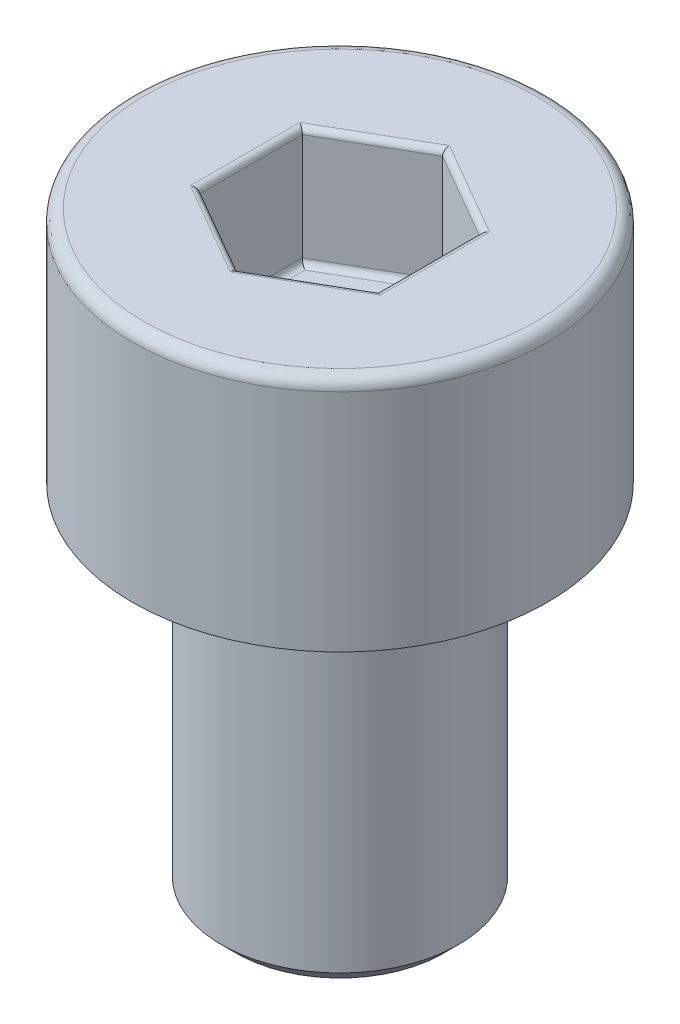
ISO-10303-21;
HEADER;
FILE_DESCRIPTION(('STEP AP214'),'2;1');
FILE_NAME('part.step','',(''),(''),'','','');
FILE_SCHEMA(('AUTOMOTIVE_DESIGN { 1 0 10303 214 1 1 1 1 }'));
ENDSEC;
DATA;
#1=APPLICATION_CONTEXT('core data for automotive mechanical design processes');
#2=APPLICATION_PROTOCOL_DEFINITION('international standard','automotive_design',2000,#1);
#3=PRODUCT_CONTEXT('',#1,'mechanical');
#4=PRODUCT('Part','Part','',(#3));
#5=PRODUCT_RELATED_PRODUCT_CATEGORY('part','',(#4));
#6=PRODUCT_DEFINITION_FORMATION('','',#4);
#7=PRODUCT_DEFINITION_CONTEXT('part definition',#1,'design');
#8=PRODUCT_DEFINITION('design','',#6,#7);
#9=PRODUCT_DEFINITION_SHAPE('','',#8);
#10=(LENGTH_UNIT() NAMED_UNIT(*) SI_UNIT(.MILLI.,.METRE.));
#11=(NAMED_UNIT(*) PLANE_ANGLE_UNIT() SI_UNIT($,.RADIAN.));
#12=(NAMED_UNIT(*) SI_UNIT($,.STERADIAN.) SOLID_ANGLE_UNIT());
#13=UNCERTAINTY_MEASURE_WITH_UNIT(LENGTH_MEASURE(1.E-05),#10,'distance_accuracy_value','');
#14=(GEOMETRIC_REPRESENTATION_CONTEXT(3) GLOBAL_UNCERTAINTY_ASSIGNED_CONTEXT((#13)) GLOBAL_UNIT_ASSIGNED_CONTEXT((#10,
#11,#12)) REPRESENTATION_CONTEXT('',''));
#15=CARTESIAN_POINT('',(0.,0.,0.));
#16=DIRECTION('',(0.,0.,1.));
#17=DIRECTION('',(1.,0.,0.));
#18=AXIS2_PLACEMENT_3D('',#15,#16,#17);
#19=CARTESIAN_POINT('',(0.,-10.,0.));
#20=DIRECTION('',(0.,-1.,0.));
#21=DIRECTION('',(0.,0.,-1.));
#22=AXIS2_PLACEMENT_3D('',#19,#20,#21);
#23=PLANE('',#22);
#24=CARTESIAN_POINT('',(0.,-10.,0.));
#25=DIRECTION('',(0.,-1.,0.));
#26=DIRECTION('',(0.,0.,-1.));
#27=AXIS2_PLACEMENT_3D('',#24,#25,#26);
#28=CIRCLE('',#27,1.74999999999999);
#29=CARTESIAN_POINT('',(0.,-10.,-1.74999999999999));
#30=VERTEX_POINT('',#29);
#31=EDGE_CURVE('E261',#30,#30,#28,.T.);
#32=ORIENTED_EDGE('',*,*,#31,.T.);
#33=EDGE_LOOP('',(#32));
#34=FACE_BOUND('',#33,.T.);
#35=ADVANCED_FACE('F33',(#34),#23,.T.);
#36=CARTESIAN_POINT('',(0.,0.,0.));
#37=DIRECTION('',(0.,1.,0.));
#38=DIRECTION('',(0.,0.,1.));
#39=AXIS2_PLACEMENT_3D('',#36,#37,#38);
#40=CYLINDRICAL_SURFACE('',#39,2.);
#41=CARTESIAN_POINT('',(0.,-4.25,0.));
#42=DIRECTION('',(0.,-1.,0.));
#43=DIRECTION('',(0.,0.,-1.));
#44=AXIS2_PLACEMENT_3D('',#41,#42,#43);
#45=CIRCLE('',#44,2.);
#46=CARTESIAN_POINT('',(0.,-4.25,-2.));
#47=VERTEX_POINT('',#46);
#48=EDGE_CURVE('E258',#47,#47,#45,.T.);
#49=ORIENTED_EDGE('',*,*,#48,.T.);
#50=EDGE_LOOP('',(#49));
#51=FACE_BOUND('',#50,.T.);
#52=CARTESIAN_POINT('',(0.,-9.75,0.));
#53=DIRECTION('',(0.,-1.,0.));
#54=DIRECTION('',(0.,0.,-1.));
#55=AXIS2_PLACEMENT_3D('',#52,#53,#54);
#56=CIRCLE('',#55,2.);
#57=CARTESIAN_POINT('',(0.,-9.75,-2.));
#58=VERTEX_POINT('',#57);
#59=EDGE_CURVE('E255',#58,#58,#56,.F.);
#60=ORIENTED_EDGE('',*,*,#59,.T.);
#61=EDGE_LOOP('',(#60));
#62=FACE_BOUND('',#61,.T.);
#63=ADVANCED_FACE('F287',(#51,#62),#40,.T.);
#64=CARTESIAN_POINT('',(-2.,-4.,0.));
#65=DIRECTION('',(0.,-1.,0.));
#66=DIRECTION('',(0.,0.,-1.));
#67=AXIS2_PLACEMENT_3D('',#64,#65,#66);
#68=PLANE('',#67);
#69=CARTESIAN_POINT('',(0.,-4.,0.));
#70=DIRECTION('',(0.,-1.,0.));
#71=DIRECTION('',(0.,0.,-1.));
#72=AXIS2_PLACEMENT_3D('',#69,#70,#71);
#73=CIRCLE('',#72,2.25);
#74=CARTESIAN_POINT('',(0.,-4.,-2.25));
#75=VERTEX_POINT('',#74);
#76=EDGE_CURVE('E252',#75,#75,#73,.F.);
#77=ORIENTED_EDGE('',*,*,#76,.T.);
#78=EDGE_LOOP('',(#77));
#79=FACE_BOUND('',#78,.T.);
#80=CARTESIAN_POINT('',(0.,-4.,0.));
#81=DIRECTION('',(0.,1.,0.));
#82=DIRECTION('',(0.,0.,1.));
#83=AXIS2_PLACEMENT_3D('',#80,#81,#82);
#84=CIRCLE('',#83,3.5);
#85=CARTESIAN_POINT('',(0.,-4.,3.5));
#86=VERTEX_POINT('',#85);
#87=EDGE_CURVE('E249',#86,#86,#84,.T.);
#88=ORIENTED_EDGE('',*,*,#87,.F.);
#89=EDGE_LOOP('',(#88));
#90=FACE_BOUND('',#89,.T.);
#91=ADVANCED_FACE('F293',(#79,#90),#68,.T.);
#92=CARTESIAN_POINT('',(0.,0.,0.));
#93=DIRECTION('',(0.,1.,0.));
#94=DIRECTION('',(0.,0.,1.));
#95=AXIS2_PLACEMENT_3D('',#92,#93,#94);
#96=CYLINDRICAL_SURFACE('',#95,3.5);
#97=CARTESIAN_POINT('',(0.,-0.2,0.));
#98=DIRECTION('',(0.,1.,0.));
#99=DIRECTION('',(0.,0.,1.));
#100=AXIS2_PLACEMENT_3D('',#97,#98,#99);
#101=CIRCLE('',#100,3.5);
#102=CARTESIAN_POINT('',(0.,-0.2,3.5));
#103=VERTEX_POINT('',#102);
#104=EDGE_CURVE('E159',#103,#103,#101,.F.);
#105=ORIENTED_EDGE('',*,*,#104,.T.);
#106=EDGE_LOOP('',(#105));
#107=FACE_BOUND('',#106,.T.);
#108=ORIENTED_EDGE('',*,*,#87,.T.);
#109=EDGE_LOOP('',(#108));
#110=FACE_BOUND('',#109,.T.);
#111=ADVANCED_FACE('F303',(#107,#110),#96,.T.);
#112=CARTESIAN_POINT('',(-3.5,0.,0.));
#113=DIRECTION('',(0.,1.,0.));
#114=DIRECTION('',(0.,0.,1.));
#115=AXIS2_PLACEMENT_3D('',#112,#113,#114);
#116=PLANE('',#115);
#117=DIRECTION('',(0.,0.,1.));
#118=VECTOR('',#117,1.);
#119=CARTESIAN_POINT('',(-1.6,0.,-0.86602540378444));
#120=LINE('',#119,#118);
#121=CARTESIAN_POINT('',(-1.6,0.,0.923760430703401));
#122=VERTEX_POINT('',#121);
#123=CARTESIAN_POINT('',(-1.6,0.,-0.923760430703403));
#124=VERTEX_POINT('',#123);
#125=EDGE_CURVE('E175',#122,#124,#120,.F.);
#126=ORIENTED_EDGE('',*,*,#125,.T.);
#127=DIRECTION('',(-0.866025403784439,0.,0.5));
#128=VECTOR('',#127,1.);
#129=CARTESIAN_POINT('',(-0.0499999999999999,0.,-1.81865334794732));
#130=LINE('',#129,#128);
#131=CARTESIAN_POINT('',(0.,0.,-1.8475208614068));
#132=VERTEX_POINT('',#131);
#133=EDGE_CURVE('E134',#124,#132,#130,.F.);
#134=ORIENTED_EDGE('',*,*,#133,.T.);
#135=DIRECTION('',(-0.866025403784439,0.,-0.5));
#136=VECTOR('',#135,1.);
#137=CARTESIAN_POINT('',(1.55,0.,-0.952627944162884));
#138=LINE('',#137,#136);
#139=CARTESIAN_POINT('',(1.6,0.,-0.923760430703403));
#140=VERTEX_POINT('',#139);
#141=EDGE_CURVE('E161',#132,#140,#138,.F.);
#142=ORIENTED_EDGE('',*,*,#141,.T.);
#143=DIRECTION('',(0.,0.,-1.));
#144=VECTOR('',#143,1.);
#145=CARTESIAN_POINT('',(1.6,0.,0.866025403784439));
#146=LINE('',#145,#144);
#147=CARTESIAN_POINT('',(1.6,0.,0.923760430703402));
#148=VERTEX_POINT('',#147);
#149=EDGE_CURVE('E169',#140,#148,#146,.F.);
#150=ORIENTED_EDGE('',*,*,#149,.T.);
#151=DIRECTION('',(0.866025403784439,0.,-0.5));
#152=VECTOR('',#151,1.);
#153=CARTESIAN_POINT('',(0.0499999999999988,0.,1.81865334794732));
#154=LINE('',#153,#152);
#155=CARTESIAN_POINT('',(0.,0.,1.8475208614068));
#156=VERTEX_POINT('',#155);
#157=EDGE_CURVE('E171',#148,#156,#154,.F.);
#158=ORIENTED_EDGE('',*,*,#157,.T.);
#159=DIRECTION('',(0.866025403784439,0.,0.5));
#160=VECTOR('',#159,1.);
#161=CARTESIAN_POINT('',(-1.55,0.,0.952627944162882));
#162=LINE('',#161,#160);
#163=EDGE_CURVE('E173',#156,#122,#162,.F.);
#164=ORIENTED_EDGE('',*,*,#163,.T.);
#165=EDGE_LOOP('',(#126,#134,#142,#150,#158,#164));
#166=FACE_BOUND('',#165,.T.);
#167=CARTESIAN_POINT('',(0.,0.,0.));
#168=DIRECTION('',(0.,1.,0.));
#169=DIRECTION('',(0.,0.,1.));
#170=AXIS2_PLACEMENT_3D('',#167,#168,#169);
#171=CIRCLE('',#170,3.3);
#172=CARTESIAN_POINT('',(0.,0.,3.3));
#173=VERTEX_POINT('',#172);
#174=EDGE_CURVE('E164',#173,#173,#171,.T.);
#175=ORIENTED_EDGE('',*,*,#174,.T.);
#176=EDGE_LOOP('',(#175));
#177=FACE_BOUND('',#176,.T.);
#178=ADVANCED_FACE('F266',(#166,#177),#116,.T.);
#179=CARTESIAN_POINT('',(0.,-4.,0.));
#180=DIRECTION('',(0.,1.,0.));
#181=DIRECTION('',(0.,0.,1.));
#182=AXIS2_PLACEMENT_3D('',#179,#180,#181);
#183=CONICAL_SURFACE('',#182,2.25,0.785398163397455);
#184=ORIENTED_EDGE('',*,*,#48,.F.);
#185=EDGE_LOOP('',(#184));
#186=FACE_BOUND('',#185,.T.);
#187=ORIENTED_EDGE('',*,*,#76,.F.);
#188=EDGE_LOOP('',(#187));
#189=FACE_BOUND('',#188,.T.);
#190=ADVANCED_FACE('F281',(#186,#189),#183,.T.);
#191=CARTESIAN_POINT('',(0.,-9.75,0.));
#192=DIRECTION('',(0.,1.,0.));
#193=DIRECTION('',(0.,0.,1.));
#194=AXIS2_PLACEMENT_3D('',#191,#192,#193);
#195=CONICAL_SURFACE('',#194,2.,0.785398163397455);
#196=ORIENTED_EDGE('',*,*,#31,.F.);
#197=EDGE_LOOP('',(#196));
#198=FACE_BOUND('',#197,.T.);
#199=ORIENTED_EDGE('',*,*,#59,.F.);
#200=EDGE_LOOP('',(#199));
#201=FACE_BOUND('',#200,.T.);
#202=ADVANCED_FACE('F271',(#198,#201),#195,.T.);
#203=CARTESIAN_POINT('',(0.,-0.2,0.));
#204=DIRECTION('',(0.,1.,0.));
#205=DIRECTION('',(0.,0.,1.));
#206=AXIS2_PLACEMENT_3D('',#203,#204,#205);
#207=TOROIDAL_SURFACE('',#206,3.3,0.2);
#208=ORIENTED_EDGE('',*,*,#104,.F.);
#209=EDGE_LOOP('',(#208));
#210=FACE_BOUND('',#209,.T.);
#211=ORIENTED_EDGE('',*,*,#174,.F.);
#212=EDGE_LOOP('',(#211));
#213=FACE_BOUND('',#212,.T.);
#214=ADVANCED_FACE('F268',(#210,#213),#207,.T.);
#215=CARTESIAN_POINT('',(1.5,-2.,-0.86602540378444));
#216=DIRECTION('',(0.5,0.,-0.866025403784439));
#217=DIRECTION('',(-0.866025403784439,0.,-0.5));
#218=AXIS2_PLACEMENT_3D('',#215,#216,#217);
#219=PLANE('',#218);
#220=DIRECTION('',(0.,1.,0.));
#221=VECTOR('',#220,1.);
#222=CARTESIAN_POINT('',(1.5,-2.,-0.86602540378444));
#223=LINE('',#222,#221);
#224=CARTESIAN_POINT('',(1.5,-1.9,-0.86602540378444));
#225=VERTEX_POINT('',#224);
#226=CARTESIAN_POINT('',(1.5,-0.1,-0.86602540378444));
#227=VERTEX_POINT('',#226);
#228=EDGE_CURVE('E243',#225,#227,#223,.T.);
#229=ORIENTED_EDGE('',*,*,#228,.T.);
#230=DIRECTION('',(-0.866025403784439,0.,-0.5));
#231=VECTOR('',#230,1.);
#232=CARTESIAN_POINT('',(0.,-0.1,-1.73205080756888));
#233=LINE('',#232,#231);
#234=CARTESIAN_POINT('',(0.,-0.1,-1.73205080756888));
#235=VERTEX_POINT('',#234);
#236=EDGE_CURVE('E195',#227,#235,#233,.T.);
#237=ORIENTED_EDGE('',*,*,#236,.T.);
#238=DIRECTION('',(0.,1.,0.));
#239=VECTOR('',#238,1.);
#240=CARTESIAN_POINT('',(0.,-2.,-1.73205080756888));
#241=LINE('',#240,#239);
#242=CARTESIAN_POINT('',(0.,-1.9,-1.73205080756888));
#243=VERTEX_POINT('',#242);
#244=EDGE_CURVE('E145',#243,#235,#241,.T.);
#245=ORIENTED_EDGE('',*,*,#244,.F.);
#246=DIRECTION('',(-0.866025403784439,0.,-0.5));
#247=VECTOR('',#246,1.);
#248=CARTESIAN_POINT('',(1.5,-1.9,-0.86602540378444));
#249=LINE('',#248,#247);
#250=EDGE_CURVE('E193',#243,#225,#249,.F.);
#251=ORIENTED_EDGE('',*,*,#250,.T.);
#252=EDGE_LOOP('',(#229,#237,#245,#251));
#253=FACE_BOUND('',#252,.T.);
#254=ADVANCED_FACE('F270',(#253),#219,.F.);
#255=CARTESIAN_POINT('',(1.5,-2.,0.866025403784439));
#256=DIRECTION('',(1.,0.,0.));
#257=DIRECTION('',(0.,0.,-1.));
#258=AXIS2_PLACEMENT_3D('',#255,#256,#257);
#259=PLANE('',#258);
#260=DIRECTION('',(0.,1.,0.));
#261=VECTOR('',#260,1.);
#262=CARTESIAN_POINT('',(1.5,-2.,0.866025403784439));
#263=LINE('',#262,#261);
#264=CARTESIAN_POINT('',(1.5,-1.9,0.866025403784439));
#265=VERTEX_POINT('',#264);
#266=CARTESIAN_POINT('',(1.5,-0.1,0.866025403784439));
#267=VERTEX_POINT('',#266);
#268=EDGE_CURVE('E240',#265,#267,#263,.T.);
#269=ORIENTED_EDGE('',*,*,#268,.T.);
#270=DIRECTION('',(0.,0.,-1.));
#271=VECTOR('',#270,1.);
#272=CARTESIAN_POINT('',(1.5,-0.1,-0.86602540378444));
#273=LINE('',#272,#271);
#274=EDGE_CURVE('E191',#267,#227,#273,.T.);
#275=ORIENTED_EDGE('',*,*,#274,.T.);
#276=ORIENTED_EDGE('',*,*,#228,.F.);
#277=DIRECTION('',(0.,0.,-1.));
#278=VECTOR('',#277,1.);
#279=CARTESIAN_POINT('',(1.5,-1.9,0.866025403784439));
#280=LINE('',#279,#278);
#281=EDGE_CURVE('E188',#225,#265,#280,.F.);
#282=ORIENTED_EDGE('',*,*,#281,.T.);
#283=EDGE_LOOP('',(#269,#275,#276,#282));
#284=FACE_BOUND('',#283,.T.);
#285=ADVANCED_FACE('F278',(#284),#259,.F.);
#286=CARTESIAN_POINT('',(0.,-2.,1.73205080756888));
#287=DIRECTION('',(0.5,0.,0.866025403784439));
#288=DIRECTION('',(0.866025403784439,0.,-0.5));
#289=AXIS2_PLACEMENT_3D('',#286,#287,#288);
#290=PLANE('',#289);
#291=DIRECTION('',(0.,1.,0.));
#292=VECTOR('',#291,1.);
#293=CARTESIAN_POINT('',(0.,-2.,1.73205080756888));
#294=LINE('',#293,#292);
#295=CARTESIAN_POINT('',(0.,-1.9,1.73205080756888));
#296=VERTEX_POINT('',#295);
#297=CARTESIAN_POINT('',(0.,-0.1,1.73205080756888));
#298=VERTEX_POINT('',#297);
#299=EDGE_CURVE('E237',#296,#298,#294,.T.);
#300=ORIENTED_EDGE('',*,*,#299,.T.);
#301=DIRECTION('',(0.866025403784439,0.,-0.5));
#302=VECTOR('',#301,1.);
#303=CARTESIAN_POINT('',(1.5,-0.1,0.866025403784439));
#304=LINE('',#303,#302);
#305=EDGE_CURVE('E186',#298,#267,#304,.T.);
#306=ORIENTED_EDGE('',*,*,#305,.T.);
#307=ORIENTED_EDGE('',*,*,#268,.F.);
#308=DIRECTION('',(0.866025403784439,0.,-0.5));
#309=VECTOR('',#308,1.);
#310=CARTESIAN_POINT('',(0.,-1.9,1.73205080756888));
#311=LINE('',#310,#309);
#312=EDGE_CURVE('E184',#265,#296,#311,.F.);
#313=ORIENTED_EDGE('',*,*,#312,.T.);
#314=EDGE_LOOP('',(#300,#306,#307,#313));
#315=FACE_BOUND('',#314,.T.);
#316=ADVANCED_FACE('F327',(#315),#290,.F.);
#317=CARTESIAN_POINT('',(-1.5,-2.,0.866025403784438));
#318=DIRECTION('',(-0.5,0.,0.866025403784439));
#319=DIRECTION('',(0.866025403784439,0.,0.5));
#320=AXIS2_PLACEMENT_3D('',#317,#318,#319);
#321=PLANE('',#320);
#322=DIRECTION('',(0.,1.,0.));
#323=VECTOR('',#322,1.);
#324=CARTESIAN_POINT('',(-1.5,-2.,0.866025403784438));
#325=LINE('',#324,#323);
#326=CARTESIAN_POINT('',(-1.5,-1.9,0.866025403784438));
#327=VERTEX_POINT('',#326);
#328=CARTESIAN_POINT('',(-1.5,-0.1,0.866025403784438));
#329=VERTEX_POINT('',#328);
#330=EDGE_CURVE('E128',#327,#329,#325,.T.);
#331=ORIENTED_EDGE('',*,*,#330,.T.);
#332=DIRECTION('',(0.866025403784439,0.,0.5));
#333=VECTOR('',#332,1.);
#334=CARTESIAN_POINT('',(0.,-0.1,1.73205080756888));
#335=LINE('',#334,#333);
#336=EDGE_CURVE('E182',#329,#298,#335,.T.);
#337=ORIENTED_EDGE('',*,*,#336,.T.);
#338=ORIENTED_EDGE('',*,*,#299,.F.);
#339=DIRECTION('',(0.866025403784439,0.,0.5));
#340=VECTOR('',#339,1.);
#341=CARTESIAN_POINT('',(-1.5,-1.9,0.866025403784438));
#342=LINE('',#341,#340);
#343=EDGE_CURVE('E180',#296,#327,#342,.F.);
#344=ORIENTED_EDGE('',*,*,#343,.T.);
#345=EDGE_LOOP('',(#331,#337,#338,#344));
#346=FACE_BOUND('',#345,.T.);
#347=ADVANCED_FACE('F234',(#346),#321,.F.);
#348=CARTESIAN_POINT('',(-1.5,-2.,-0.86602540378444));
#349=DIRECTION('',(-1.,0.,0.));
#350=DIRECTION('',(0.,0.,1.));
#351=AXIS2_PLACEMENT_3D('',#348,#349,#350);
#352=PLANE('',#351);
#353=DIRECTION('',(0.,1.,0.));
#354=VECTOR('',#353,1.);
#355=CARTESIAN_POINT('',(-1.5,-2.,-0.86602540378444));
#356=LINE('',#355,#354);
#357=CARTESIAN_POINT('',(-1.5,-1.9,-0.86602540378444));
#358=VERTEX_POINT('',#357);
#359=CARTESIAN_POINT('',(-1.5,-0.1,-0.86602540378444));
#360=VERTEX_POINT('',#359);
#361=EDGE_CURVE('E126',#358,#360,#356,.T.);
#362=ORIENTED_EDGE('',*,*,#361,.T.);
#363=DIRECTION('',(0.,0.,1.));
#364=VECTOR('',#363,1.);
#365=CARTESIAN_POINT('',(-1.5,-0.1,0.866025403784438));
#366=LINE('',#365,#364);
#367=EDGE_CURVE('E133',#360,#329,#366,.T.);
#368=ORIENTED_EDGE('',*,*,#367,.T.);
#369=ORIENTED_EDGE('',*,*,#330,.F.);
#370=DIRECTION('',(0.,0.,1.));
#371=VECTOR('',#370,1.);
#372=CARTESIAN_POINT('',(-1.5,-1.9,-0.86602540378444));
#373=LINE('',#372,#371);
#374=EDGE_CURVE('E123',#327,#358,#373,.F.);
#375=ORIENTED_EDGE('',*,*,#374,.T.);
#376=EDGE_LOOP('',(#362,#368,#369,#375));
#377=FACE_BOUND('',#376,.T.);
#378=ADVANCED_FACE('F125',(#377),#352,.F.);
#379=CARTESIAN_POINT('',(0.,-2.,-1.73205080756888));
#380=DIRECTION('',(-0.5,0.,-0.866025403784439));
#381=DIRECTION('',(-0.866025403784439,0.,0.5));
#382=AXIS2_PLACEMENT_3D('',#379,#380,#381);
#383=PLANE('',#382);
#384=ORIENTED_EDGE('',*,*,#244,.T.);
#385=DIRECTION('',(-0.866025403784439,0.,0.5));
#386=VECTOR('',#385,1.);
#387=CARTESIAN_POINT('',(-1.5,-0.1,-0.86602540378444));
#388=LINE('',#387,#386);
#389=EDGE_CURVE('E144',#235,#360,#388,.T.);
#390=ORIENTED_EDGE('',*,*,#389,.T.);
#391=ORIENTED_EDGE('',*,*,#361,.F.);
#392=DIRECTION('',(-0.866025403784439,0.,0.5));
#393=VECTOR('',#392,1.);
#394=CARTESIAN_POINT('',(0.,-1.9,-1.73205080756888));
#395=LINE('',#394,#393);
#396=EDGE_CURVE('E141',#358,#243,#395,.F.);
#397=ORIENTED_EDGE('',*,*,#396,.T.);
#398=EDGE_LOOP('',(#384,#390,#391,#397));
#399=FACE_BOUND('',#398,.T.);
#400=ADVANCED_FACE('F139',(#399),#383,.F.);
#401=CARTESIAN_POINT('',(1.5,-2.,-0.86602540378444));
#402=DIRECTION('',(0.,-1.,0.));
#403=DIRECTION('',(0.,0.,-1.));
#404=AXIS2_PLACEMENT_3D('',#401,#402,#403);
#405=PLANE('',#404);
#406=DIRECTION('',(0.866025403784439,0.,-0.5));
#407=VECTOR('',#406,1.);
#408=CARTESIAN_POINT('',(1.45,-2.,0.779422863405995));
#409=LINE('',#408,#407);
#410=CARTESIAN_POINT('',(0.,-2.,1.61658075373095));
#411=VERTEX_POINT('',#410);
#412=CARTESIAN_POINT('',(1.4,-2.,0.808290376865476));
#413=VERTEX_POINT('',#412);
#414=EDGE_CURVE('E42',#411,#413,#409,.T.);
#415=ORIENTED_EDGE('',*,*,#414,.T.);
#416=DIRECTION('',(0.,0.,-1.));
#417=VECTOR('',#416,1.);
#418=CARTESIAN_POINT('',(1.4,-2.,-0.86602540378444));
#419=LINE('',#418,#417);
#420=CARTESIAN_POINT('',(1.4,-2.,-0.808290376865478));
#421=VERTEX_POINT('',#420);
#422=EDGE_CURVE('E11',#413,#421,#419,.T.);
#423=ORIENTED_EDGE('',*,*,#422,.T.);
#424=DIRECTION('',(-0.866025403784439,0.,-0.5));
#425=VECTOR('',#424,1.);
#426=CARTESIAN_POINT('',(-0.0500000000000001,-2.,-1.64544826719043));
#427=LINE('',#426,#425);
#428=CARTESIAN_POINT('',(0.,-2.,-1.61658075373095));
#429=VERTEX_POINT('',#428);
#430=EDGE_CURVE('E197',#421,#429,#427,.T.);
#431=ORIENTED_EDGE('',*,*,#430,.T.);
#432=DIRECTION('',(-0.866025403784439,0.,0.5));
#433=VECTOR('',#432,1.);
#434=CARTESIAN_POINT('',(-1.45,-2.,-0.779422863405997));
#435=LINE('',#434,#433);
#436=CARTESIAN_POINT('',(-1.4,-2.,-0.808290376865478));
#437=VERTEX_POINT('',#436);
#438=EDGE_CURVE('E199',#429,#437,#435,.T.);
#439=ORIENTED_EDGE('',*,*,#438,.T.);
#440=DIRECTION('',(0.,0.,1.));
#441=VECTOR('',#440,1.);
#442=CARTESIAN_POINT('',(-1.4,-2.,0.866025403784438));
#443=LINE('',#442,#441);
#444=CARTESIAN_POINT('',(-1.4,-2.,0.808290376865476));
#445=VERTEX_POINT('',#444);
#446=EDGE_CURVE('E150',#437,#445,#443,.T.);
#447=ORIENTED_EDGE('',*,*,#446,.T.);
#448=DIRECTION('',(0.866025403784439,0.,0.5));
#449=VECTOR('',#448,1.);
#450=CARTESIAN_POINT('',(0.0499999999999989,-2.,1.64544826719043));
#451=LINE('',#450,#449);
#452=EDGE_CURVE('E53',#445,#411,#451,.T.);
#453=ORIENTED_EDGE('',*,*,#452,.T.);
#454=EDGE_LOOP('',(#415,#423,#431,#439,#447,#453));
#455=FACE_BOUND('',#454,.T.);
#456=ADVANCED_FACE('F322',(#455),#405,.F.);
#457=CARTESIAN_POINT('',(0.0499999999999988,-0.1,1.81865334794732));
#458=DIRECTION('',(-0.866025403784439,0.,0.5));
#459=DIRECTION('',(0.5,0.,0.866025403784439));
#460=AXIS2_PLACEMENT_3D('',#457,#458,#459);
#461=CYLINDRICAL_SURFACE('',#460,0.1);
#462=CARTESIAN_POINT('',(0.,-0.1,1.8475208614068));
#463=DIRECTION('',(-1.,0.,0.));
#464=DIRECTION('',(0.,0.,-1.));
#465=AXIS2_PLACEMENT_3D('',#462,#463,#464);
#466=ELLIPSE('',#465,0.115470053837925,0.1);
#467=EDGE_CURVE('E214',#156,#298,#466,.T.);
#468=ORIENTED_EDGE('',*,*,#467,.F.);
#469=ORIENTED_EDGE('',*,*,#157,.F.);
#470=CARTESIAN_POINT('',(1.6,-0.1,0.923760430703402));
#471=DIRECTION('',(-0.5,0.,0.866025403784439));
#472=DIRECTION('',(-0.866025403784439,0.,-0.5));
#473=AXIS2_PLACEMENT_3D('',#470,#471,#472);
#474=ELLIPSE('',#473,0.115470053837925,0.1);
#475=EDGE_CURVE('E217',#267,#148,#474,.F.);
#476=ORIENTED_EDGE('',*,*,#475,.F.);
#477=ORIENTED_EDGE('',*,*,#305,.F.);
#478=EDGE_LOOP('',(#468,#469,#476,#477));
#479=FACE_BOUND('',#478,.T.);
#480=ADVANCED_FACE('F334',(#479),#461,.T.);
#481=CARTESIAN_POINT('',(1.6,-0.1,0.866025403784439));
#482=DIRECTION('',(0.,0.,1.));
#483=DIRECTION('',(1.,0.,0.));
#484=AXIS2_PLACEMENT_3D('',#481,#482,#483);
#485=CYLINDRICAL_SURFACE('',#484,0.1);
#486=ORIENTED_EDGE('',*,*,#475,.T.);
#487=ORIENTED_EDGE('',*,*,#149,.F.);
#488=CARTESIAN_POINT('',(1.6,-0.1,-0.923760430703402));
#489=DIRECTION('',(0.5,0.,0.866025403784439));
#490=DIRECTION('',(-0.866025403784439,0.,0.5));
#491=AXIS2_PLACEMENT_3D('',#488,#489,#490);
#492=ELLIPSE('',#491,0.115470053837925,0.1);
#493=EDGE_CURVE('E211',#227,#140,#492,.F.);
#494=ORIENTED_EDGE('',*,*,#493,.F.);
#495=ORIENTED_EDGE('',*,*,#274,.F.);
#496=EDGE_LOOP('',(#486,#487,#494,#495));
#497=FACE_BOUND('',#496,.T.);
#498=ADVANCED_FACE('F338',(#497),#485,.T.);
#499=CARTESIAN_POINT('',(-1.55,-0.1,0.952627944162882));
#500=DIRECTION('',(-0.866025403784439,0.,-0.5));
#501=DIRECTION('',(-0.5,0.,0.866025403784439));
#502=AXIS2_PLACEMENT_3D('',#499,#500,#501);
#503=CYLINDRICAL_SURFACE('',#502,0.1);
#504=ORIENTED_EDGE('',*,*,#467,.T.);
#505=ORIENTED_EDGE('',*,*,#336,.F.);
#506=CARTESIAN_POINT('',(-1.6,-0.1,0.923760430703401));
#507=DIRECTION('',(-0.5,0.,-0.866025403784439));
#508=DIRECTION('',(0.866025403784439,0.,-0.5));
#509=AXIS2_PLACEMENT_3D('',#506,#507,#508);
#510=ELLIPSE('',#509,0.115470053837925,0.1);
#511=EDGE_CURVE('E208',#122,#329,#510,.T.);
#512=ORIENTED_EDGE('',*,*,#511,.F.);
#513=ORIENTED_EDGE('',*,*,#163,.F.);
#514=EDGE_LOOP('',(#504,#505,#512,#513));
#515=FACE_BOUND('',#514,.T.);
#516=ADVANCED_FACE('F344',(#515),#503,.T.);
#517=CARTESIAN_POINT('',(1.55,-0.1,-0.952627944162884));
#518=DIRECTION('',(0.866025403784439,0.,0.5));
#519=DIRECTION('',(0.5,0.,-0.866025403784439));
#520=AXIS2_PLACEMENT_3D('',#517,#518,#519);
#521=CYLINDRICAL_SURFACE('',#520,0.1);
#522=ORIENTED_EDGE('',*,*,#493,.T.);
#523=ORIENTED_EDGE('',*,*,#141,.F.);
#524=CARTESIAN_POINT('',(0.,-0.1,-1.8475208614068));
#525=DIRECTION('',(1.,0.,0.));
#526=DIRECTION('',(0.,0.,-1.));
#527=AXIS2_PLACEMENT_3D('',#524,#525,#526);
#528=ELLIPSE('',#527,0.115470053837925,0.1);
#529=EDGE_CURVE('E206',#235,#132,#528,.F.);
#530=ORIENTED_EDGE('',*,*,#529,.F.);
#531=ORIENTED_EDGE('',*,*,#236,.F.);
#532=EDGE_LOOP('',(#522,#523,#530,#531));
#533=FACE_BOUND('',#532,.T.);
#534=ADVANCED_FACE('F374',(#533),#521,.T.);
#535=CARTESIAN_POINT('',(-1.6,-0.1,-0.86602540378444));
#536=DIRECTION('',(0.,0.,-1.));
#537=DIRECTION('',(-1.,0.,0.));
#538=AXIS2_PLACEMENT_3D('',#535,#536,#537);
#539=CYLINDRICAL_SURFACE('',#538,0.1);
#540=ORIENTED_EDGE('',*,*,#511,.T.);
#541=ORIENTED_EDGE('',*,*,#367,.F.);
#542=CARTESIAN_POINT('',(-1.6,-0.1,-0.923760430703403));
#543=DIRECTION('',(0.5,0.,-0.866025403784439));
#544=DIRECTION('',(0.866025403784439,0.,0.5));
#545=AXIS2_PLACEMENT_3D('',#542,#543,#544);
#546=ELLIPSE('',#545,0.115470053837925,0.1);
#547=EDGE_CURVE('E204',#124,#360,#546,.T.);
#548=ORIENTED_EDGE('',*,*,#547,.F.);
#549=ORIENTED_EDGE('',*,*,#125,.F.);
#550=EDGE_LOOP('',(#540,#541,#548,#549));
#551=FACE_BOUND('',#550,.T.);
#552=ADVANCED_FACE('F369',(#551),#539,.T.);
#553=CARTESIAN_POINT('',(-0.05,-0.1,-1.81865334794732));
#554=DIRECTION('',(0.866025403784439,0.,-0.5));
#555=DIRECTION('',(-0.5,0.,-0.866025403784439));
#556=AXIS2_PLACEMENT_3D('',#553,#554,#555);
#557=CYLINDRICAL_SURFACE('',#556,0.1);
#558=ORIENTED_EDGE('',*,*,#529,.T.);
#559=ORIENTED_EDGE('',*,*,#133,.F.);
#560=ORIENTED_EDGE('',*,*,#547,.T.);
#561=ORIENTED_EDGE('',*,*,#389,.F.);
#562=EDGE_LOOP('',(#558,#559,#560,#561));
#563=FACE_BOUND('',#562,.T.);
#564=ADVANCED_FACE('F365',(#563),#557,.T.);
#565=CARTESIAN_POINT('',(-1.4,-1.9,-0.86602540378444));
#566=DIRECTION('',(0.,0.,-1.));
#567=DIRECTION('',(-1.,0.,0.));
#568=AXIS2_PLACEMENT_3D('',#565,#566,#567);
#569=CYLINDRICAL_SURFACE('',#568,0.1);
#570=CARTESIAN_POINT('',(-1.4,-1.9,-0.808290376865478));
#571=DIRECTION('',(0.5,0.,-0.866025403784439));
#572=DIRECTION('',(-0.866025403784439,0.,-0.5));
#573=AXIS2_PLACEMENT_3D('',#570,#571,#572);
#574=ELLIPSE('',#573,0.115470053837925,0.1);
#575=EDGE_CURVE('E149',#358,#437,#574,.F.);
#576=ORIENTED_EDGE('',*,*,#575,.F.);
#577=ORIENTED_EDGE('',*,*,#374,.F.);
#578=CARTESIAN_POINT('',(-1.4,-1.9,0.808290376865476));
#579=DIRECTION('',(-0.5,0.,-0.866025403784439));
#580=DIRECTION('',(-0.866025403784439,0.,0.5));
#581=AXIS2_PLACEMENT_3D('',#578,#579,#580);
#582=ELLIPSE('',#581,0.115470053837925,0.1);
#583=EDGE_CURVE('E37',#445,#327,#582,.T.);
#584=ORIENTED_EDGE('',*,*,#583,.F.);
#585=ORIENTED_EDGE('',*,*,#446,.F.);
#586=EDGE_LOOP('',(#576,#577,#584,#585));
#587=FACE_BOUND('',#586,.T.);
#588=ADVANCED_FACE('F35',(#587),#569,.F.);
#589=CARTESIAN_POINT('',(0.0499999999999984,-1.9,1.64544826719043));
#590=DIRECTION('',(-0.866025403784439,0.,-0.5));
#591=DIRECTION('',(-0.5,0.,0.866025403784439));
#592=AXIS2_PLACEMENT_3D('',#589,#590,#591);
#593=CYLINDRICAL_SURFACE('',#592,0.1);
#594=ORIENTED_EDGE('',*,*,#583,.T.);
#595=ORIENTED_EDGE('',*,*,#343,.F.);
#596=CARTESIAN_POINT('',(0.,-1.9,1.61658075373095));
#597=DIRECTION('',(-1.,0.,0.));
#598=DIRECTION('',(0.,0.,1.));
#599=AXIS2_PLACEMENT_3D('',#596,#597,#598);
#600=ELLIPSE('',#599,0.115470053837925,0.1);
#601=EDGE_CURVE('E153',#411,#296,#600,.T.);
#602=ORIENTED_EDGE('',*,*,#601,.F.);
#603=ORIENTED_EDGE('',*,*,#452,.F.);
#604=EDGE_LOOP('',(#594,#595,#602,#603));
#605=FACE_BOUND('',#604,.T.);
#606=ADVANCED_FACE('F231',(#605),#593,.F.);
#607=CARTESIAN_POINT('',(0.8,-1.9,-2.07846096908265));
#608=DIRECTION('',(0.866025403784439,0.,-0.5));
#609=DIRECTION('',(-0.5,0.,-0.866025403784439));
#610=AXIS2_PLACEMENT_3D('',#607,#608,#609);
#611=CYLINDRICAL_SURFACE('',#610,0.1);
#612=ORIENTED_EDGE('',*,*,#575,.T.);
#613=ORIENTED_EDGE('',*,*,#438,.F.);
#614=CARTESIAN_POINT('',(0.,-1.9,-1.61658075373095));
#615=DIRECTION('',(1.,0.,0.));
#616=DIRECTION('',(0.,0.,-1.));
#617=AXIS2_PLACEMENT_3D('',#614,#615,#616);
#618=ELLIPSE('',#617,0.115470053837925,0.1);
#619=EDGE_CURVE('E157',#243,#429,#618,.F.);
#620=ORIENTED_EDGE('',*,*,#619,.F.);
#621=ORIENTED_EDGE('',*,*,#396,.F.);
#622=EDGE_LOOP('',(#612,#613,#620,#621));
#623=FACE_BOUND('',#622,.T.);
#624=ADVANCED_FACE('F155',(#623),#611,.F.);
#625=CARTESIAN_POINT('',(2.2,-1.9,0.346410161513775));
#626=DIRECTION('',(-0.866025403784439,0.,0.5));
#627=DIRECTION('',(0.5,0.,0.866025403784439));
#628=AXIS2_PLACEMENT_3D('',#625,#626,#627);
#629=CYLINDRICAL_SURFACE('',#628,0.1);
#630=ORIENTED_EDGE('',*,*,#601,.T.);
#631=ORIENTED_EDGE('',*,*,#312,.F.);
#632=CARTESIAN_POINT('',(1.4,-1.9,0.808290376865476));
#633=DIRECTION('',(-0.5,0.,0.866025403784439));
#634=DIRECTION('',(0.866025403784439,0.,0.5));
#635=AXIS2_PLACEMENT_3D('',#632,#633,#634);
#636=ELLIPSE('',#635,0.115470053837925,0.1);
#637=EDGE_CURVE('E222',#413,#265,#636,.T.);
#638=ORIENTED_EDGE('',*,*,#637,.F.);
#639=ORIENTED_EDGE('',*,*,#414,.F.);
#640=EDGE_LOOP('',(#630,#631,#638,#639));
#641=FACE_BOUND('',#640,.T.);
#642=ADVANCED_FACE('F228',(#641),#629,.F.);
#643=CARTESIAN_POINT('',(1.45,-1.9,-0.779422863405997));
#644=DIRECTION('',(0.866025403784439,0.,0.5));
#645=DIRECTION('',(0.5,0.,-0.866025403784439));
#646=AXIS2_PLACEMENT_3D('',#643,#644,#645);
#647=CYLINDRICAL_SURFACE('',#646,0.1);
#648=ORIENTED_EDGE('',*,*,#619,.T.);
#649=ORIENTED_EDGE('',*,*,#430,.F.);
#650=CARTESIAN_POINT('',(1.4,-1.9,-0.808290376865478));
#651=DIRECTION('',(0.5,0.,0.866025403784439));
#652=DIRECTION('',(-0.866025403784439,0.,0.5));
#653=AXIS2_PLACEMENT_3D('',#650,#651,#652);
#654=ELLIPSE('',#653,0.115470053837925,0.1);
#655=EDGE_CURVE('E220',#225,#421,#654,.F.);
#656=ORIENTED_EDGE('',*,*,#655,.F.);
#657=ORIENTED_EDGE('',*,*,#250,.F.);
#658=EDGE_LOOP('',(#648,#649,#656,#657));
#659=FACE_BOUND('',#658,.T.);
#660=ADVANCED_FACE('F353',(#659),#647,.F.);
#661=CARTESIAN_POINT('',(1.4,-1.9,-0.86602540378444));
#662=DIRECTION('',(0.,0.,1.));
#663=DIRECTION('',(1.,0.,0.));
#664=AXIS2_PLACEMENT_3D('',#661,#662,#663);
#665=CYLINDRICAL_SURFACE('',#664,0.1);
#666=ORIENTED_EDGE('',*,*,#637,.T.);
#667=ORIENTED_EDGE('',*,*,#281,.F.);
#668=ORIENTED_EDGE('',*,*,#655,.T.);
#669=ORIENTED_EDGE('',*,*,#422,.F.);
#670=EDGE_LOOP('',(#666,#667,#668,#669));
#671=FACE_BOUND('',#670,.T.);
#672=ADVANCED_FACE('F350',(#671),#665,.F.);
#673=CLOSED_SHELL('',(#35,#63,#91,#111,#178,#190,#202,#214,#254,#285,#316,#347,#378,#400,#456,
#480,#498,#516,#534,#552,#564,#588,#606,#624,#642,#660,#672));
#674=MANIFOLD_SOLID_BREP('B2',#673);
#675=ADVANCED_BREP_SHAPE_REPRESENTATION('',(#18,#674),#14);
#676=SHAPE_DEFINITION_REPRESENTATION(#9,#675);
ENDSEC;
END-ISO-10303-21;
